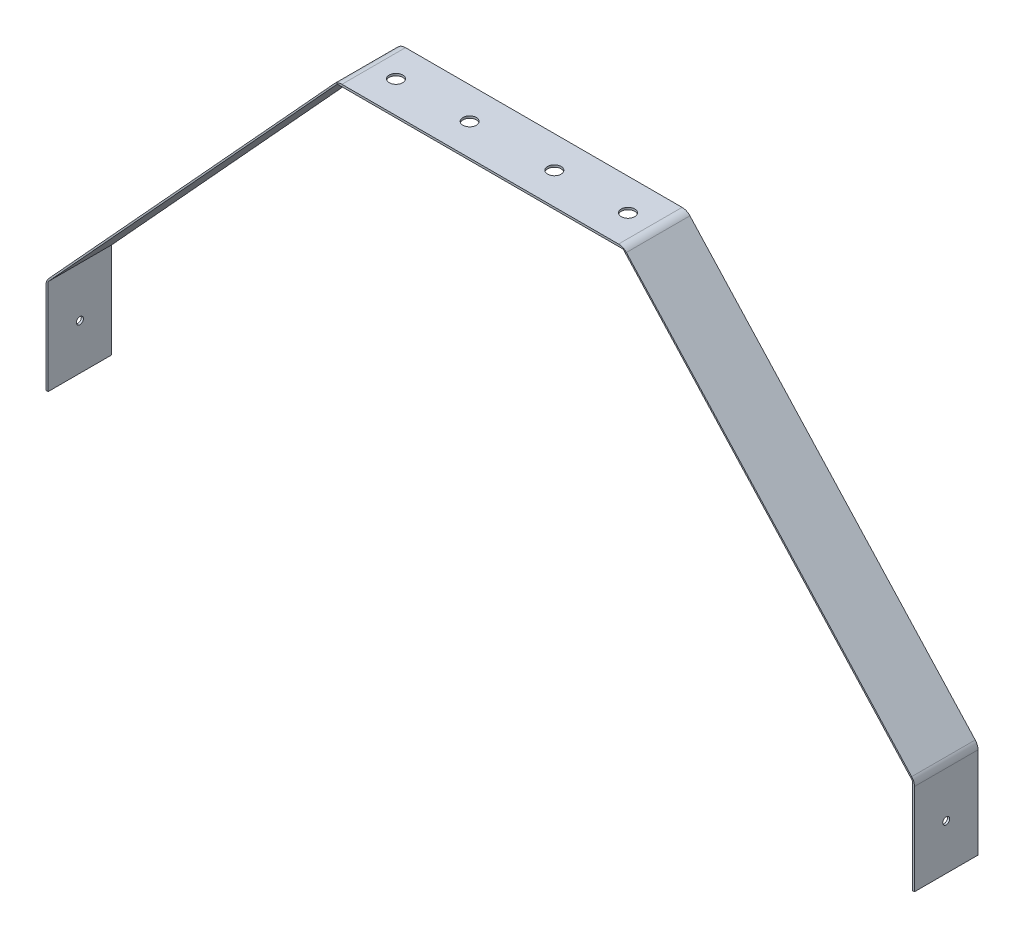
ISO-10303-21;
HEADER;
FILE_DESCRIPTION(('STEP AP214'),'2;1');
FILE_NAME('part.step','',(''),(''),'','','');
FILE_SCHEMA(('AUTOMOTIVE_DESIGN { 1 0 10303 214 1 1 1 1 }'));
ENDSEC;
DATA;
#1=APPLICATION_CONTEXT('core data for automotive mechanical design processes');
#2=APPLICATION_PROTOCOL_DEFINITION('international standard','automotive_design',2000,#1);
#3=PRODUCT_CONTEXT('',#1,'mechanical');
#4=PRODUCT('Part','Part','',(#3));
#5=PRODUCT_RELATED_PRODUCT_CATEGORY('part','',(#4));
#6=PRODUCT_DEFINITION_FORMATION('','',#4);
#7=PRODUCT_DEFINITION_CONTEXT('part definition',#1,'design');
#8=PRODUCT_DEFINITION('design','',#6,#7);
#9=PRODUCT_DEFINITION_SHAPE('','',#8);
#10=(LENGTH_UNIT() NAMED_UNIT(*) SI_UNIT(.MILLI.,.METRE.));
#11=(NAMED_UNIT(*) PLANE_ANGLE_UNIT() SI_UNIT($,.RADIAN.));
#12=(NAMED_UNIT(*) SI_UNIT($,.STERADIAN.) SOLID_ANGLE_UNIT());
#13=UNCERTAINTY_MEASURE_WITH_UNIT(LENGTH_MEASURE(1.E-05),#10,'distance_accuracy_value','');
#14=(GEOMETRIC_REPRESENTATION_CONTEXT(3) GLOBAL_UNCERTAINTY_ASSIGNED_CONTEXT((#13)) GLOBAL_UNIT_ASSIGNED_CONTEXT((#10,
#11,#12)) REPRESENTATION_CONTEXT('',''));
#15=CARTESIAN_POINT('',(0.,0.,0.));
#16=DIRECTION('',(0.,0.,1.));
#17=DIRECTION('',(1.,0.,0.));
#18=AXIS2_PLACEMENT_3D('',#15,#16,#17);
#19=CARTESIAN_POINT('',(-205.,-97.5,30.));
#20=DIRECTION('',(0.,1.,0.));
#21=DIRECTION('',(0.,0.,1.));
#22=AXIS2_PLACEMENT_3D('',#19,#20,#21);
#23=PLANE('',#22);
#24=DIRECTION('',(0.,0.,1.));
#25=VECTOR('',#24,1.);
#26=CARTESIAN_POINT('',(-204.,-97.5,0.));
#27=LINE('',#26,#25);
#28=CARTESIAN_POINT('',(-204.,-97.5,0.));
#29=VERTEX_POINT('',#28);
#30=CARTESIAN_POINT('',(-204.,-97.5,30.));
#31=VERTEX_POINT('',#30);
#32=EDGE_CURVE('E200',#29,#31,#27,.T.);
#33=ORIENTED_EDGE('',*,*,#32,.T.);
#34=DIRECTION('',(1.,0.,0.));
#35=VECTOR('',#34,1.);
#36=CARTESIAN_POINT('',(-205.,-97.5,30.));
#37=LINE('',#36,#35);
#38=CARTESIAN_POINT('',(-205.,-97.5,30.));
#39=VERTEX_POINT('',#38);
#40=EDGE_CURVE('E226',#39,#31,#37,.T.);
#41=ORIENTED_EDGE('',*,*,#40,.F.);
#42=DIRECTION('',(0.,0.,-1.));
#43=VECTOR('',#42,1.);
#44=CARTESIAN_POINT('',(-205.,-97.5,30.));
#45=LINE('',#44,#43);
#46=CARTESIAN_POINT('',(-205.,-97.5,0.));
#47=VERTEX_POINT('',#46);
#48=EDGE_CURVE('E240',#39,#47,#45,.T.);
#49=ORIENTED_EDGE('',*,*,#48,.T.);
#50=DIRECTION('',(1.,0.,0.));
#51=VECTOR('',#50,1.);
#52=CARTESIAN_POINT('',(-205.,-97.5,0.));
#53=LINE('',#52,#51);
#54=EDGE_CURVE('E221',#47,#29,#53,.T.);
#55=ORIENTED_EDGE('',*,*,#54,.T.);
#56=EDGE_LOOP('',(#33,#41,#49,#55));
#57=FACE_BOUND('',#56,.T.);
#58=ADVANCED_FACE('F38',(#57),#23,.F.);
#59=CARTESIAN_POINT('',(205.,97.5,30.));
#60=DIRECTION('',(-1.,0.,0.));
#61=DIRECTION('',(0.,-1.,0.));
#62=AXIS2_PLACEMENT_3D('',#59,#60,#61);
#63=PLANE('',#62);
#64=CARTESIAN_POINT('',(205.,-75.9724592263863,15.));
#65=DIRECTION('',(1.,0.,0.));
#66=DIRECTION('',(0.,1.,0.));
#67=AXIS2_PLACEMENT_3D('',#64,#65,#66);
#68=CIRCLE('',#67,1.65);
#69=CARTESIAN_POINT('',(205.,-74.3224592263863,15.));
#70=VERTEX_POINT('',#69);
#71=EDGE_CURVE('E292',#70,#70,#68,.T.);
#72=ORIENTED_EDGE('',*,*,#71,.F.);
#73=EDGE_LOOP('',(#72));
#74=FACE_BOUND('',#73,.T.);
#75=DIRECTION('',(0.,1.,0.));
#76=VECTOR('',#75,1.);
#77=CARTESIAN_POINT('',(205.,97.5,0.));
#78=LINE('',#77,#76);
#79=CARTESIAN_POINT('',(205.,-97.5,0.));
#80=VERTEX_POINT('',#79);
#81=CARTESIAN_POINT('',(205.,-54.4449184527726,0.));
#82=VERTEX_POINT('',#81);
#83=EDGE_CURVE('E211',#80,#82,#78,.T.);
#84=ORIENTED_EDGE('',*,*,#83,.T.);
#85=DIRECTION('',(0.,0.,1.));
#86=VECTOR('',#85,1.);
#87=CARTESIAN_POINT('',(205.,-54.4449184527726,30.));
#88=LINE('',#87,#86);
#89=CARTESIAN_POINT('',(205.,-54.4449184527726,30.));
#90=VERTEX_POINT('',#89);
#91=EDGE_CURVE('E272',#82,#90,#88,.T.);
#92=ORIENTED_EDGE('',*,*,#91,.T.);
#93=DIRECTION('',(0.,1.,0.));
#94=VECTOR('',#93,1.);
#95=CARTESIAN_POINT('',(205.,97.5,30.));
#96=LINE('',#95,#94);
#97=CARTESIAN_POINT('',(205.,-97.5,30.));
#98=VERTEX_POINT('',#97);
#99=EDGE_CURVE('E218',#98,#90,#96,.T.);
#100=ORIENTED_EDGE('',*,*,#99,.F.);
#101=DIRECTION('',(0.,0.,-1.));
#102=VECTOR('',#101,1.);
#103=CARTESIAN_POINT('',(205.,-97.5,30.));
#104=LINE('',#103,#102);
#105=EDGE_CURVE('E229',#98,#80,#104,.T.);
#106=ORIENTED_EDGE('',*,*,#105,.T.);
#107=EDGE_LOOP('',(#84,#92,#100,#106));
#108=FACE_BOUND('',#107,.T.);
#109=ADVANCED_FACE('F319',(#74,#108),#63,.F.);
#110=CARTESIAN_POINT('',(-205.,97.5,30.));
#111=DIRECTION('',(0.,-1.,0.));
#112=DIRECTION('',(0.,0.,-1.));
#113=AXIS2_PLACEMENT_3D('',#110,#111,#112);
#114=PLANE('',#113);
#115=CARTESIAN_POINT('',(-54.768749878,97.5,15.));
#116=DIRECTION('',(0.,1.,0.));
#117=DIRECTION('',(0.,0.,1.));
#118=AXIS2_PLACEMENT_3D('',#115,#116,#117);
#119=CIRCLE('',#118,3.175);
#120=CARTESIAN_POINT('',(-54.768749878,97.5,18.175));
#121=VERTEX_POINT('',#120);
#122=EDGE_CURVE('E304',#121,#121,#119,.T.);
#123=ORIENTED_EDGE('',*,*,#122,.F.);
#124=EDGE_LOOP('',(#123));
#125=FACE_BOUND('',#124,.T.);
#126=CARTESIAN_POINT('',(54.768750122,97.5,15.));
#127=DIRECTION('',(0.,1.,0.));
#128=DIRECTION('',(0.,0.,1.));
#129=AXIS2_PLACEMENT_3D('',#126,#127,#128);
#130=CIRCLE('',#129,3.17499999999998);
#131=CARTESIAN_POINT('',(54.768750122,97.5,18.175));
#132=VERTEX_POINT('',#131);
#133=EDGE_CURVE('E307',#132,#132,#130,.T.);
#134=ORIENTED_EDGE('',*,*,#133,.F.);
#135=EDGE_LOOP('',(#134));
#136=FACE_BOUND('',#135,.T.);
#137=CARTESIAN_POINT('',(20.,97.5,15.));
#138=DIRECTION('',(0.,1.,0.));
#139=DIRECTION('',(0.,0.,1.));
#140=AXIS2_PLACEMENT_3D('',#137,#138,#139);
#141=CIRCLE('',#140,3.17499999999998);
#142=CARTESIAN_POINT('',(20.,97.5,18.175));
#143=VERTEX_POINT('',#142);
#144=EDGE_CURVE('E303',#143,#143,#141,.T.);
#145=ORIENTED_EDGE('',*,*,#144,.F.);
#146=EDGE_LOOP('',(#145));
#147=FACE_BOUND('',#146,.T.);
#148=CARTESIAN_POINT('',(-20.,97.5,15.));
#149=DIRECTION('',(0.,1.,0.));
#150=DIRECTION('',(0.,0.,1.));
#151=AXIS2_PLACEMENT_3D('',#148,#149,#150);
#152=CIRCLE('',#151,3.175);
#153=CARTESIAN_POINT('',(-20.,97.5,18.175));
#154=VERTEX_POINT('',#153);
#155=EDGE_CURVE('E285',#154,#154,#152,.T.);
#156=ORIENTED_EDGE('',*,*,#155,.F.);
#157=EDGE_LOOP('',(#156));
#158=FACE_BOUND('',#157,.T.);
#159=DIRECTION('',(-1.,0.,0.));
#160=VECTOR('',#159,1.);
#161=CARTESIAN_POINT('',(-205.,97.5,30.));
#162=LINE('',#161,#160);
#163=CARTESIAN_POINT('',(65.3004914182918,97.5,30.));
#164=VERTEX_POINT('',#163);
#165=CARTESIAN_POINT('',(-65.3004914182918,97.5,30.));
#166=VERTEX_POINT('',#165);
#167=EDGE_CURVE('E220',#164,#166,#162,.T.);
#168=ORIENTED_EDGE('',*,*,#167,.F.);
#169=DIRECTION('',(0.,0.,1.));
#170=VECTOR('',#169,1.);
#171=CARTESIAN_POINT('',(65.3004914182918,97.5,0.));
#172=LINE('',#171,#170);
#173=CARTESIAN_POINT('',(65.3004914182918,97.5,0.));
#174=VERTEX_POINT('',#173);
#175=EDGE_CURVE('E267',#164,#174,#172,.F.);
#176=ORIENTED_EDGE('',*,*,#175,.T.);
#177=DIRECTION('',(-1.,0.,0.));
#178=VECTOR('',#177,1.);
#179=CARTESIAN_POINT('',(-205.,97.5,0.));
#180=LINE('',#179,#178);
#181=CARTESIAN_POINT('',(-65.3004914182918,97.5,0.));
#182=VERTEX_POINT('',#181);
#183=EDGE_CURVE('E232',#174,#182,#180,.T.);
#184=ORIENTED_EDGE('',*,*,#183,.T.);
#185=DIRECTION('',(0.,0.,1.));
#186=VECTOR('',#185,1.);
#187=CARTESIAN_POINT('',(-65.3004914182918,97.5,30.));
#188=LINE('',#187,#186);
#189=EDGE_CURVE('E252',#182,#166,#188,.T.);
#190=ORIENTED_EDGE('',*,*,#189,.T.);
#191=EDGE_LOOP('',(#168,#176,#184,#190));
#192=FACE_BOUND('',#191,.T.);
#193=ADVANCED_FACE('F315',(#125,#136,#147,#158,#192),#114,.F.);
#194=CARTESIAN_POINT('',(0.,0.,30.));
#195=DIRECTION('',(0.,0.,1.));
#196=DIRECTION('',(1.,0.,0.));
#197=AXIS2_PLACEMENT_3D('',#194,#195,#196);
#198=PLANE('',#197);
#199=ORIENTED_EDGE('',*,*,#99,.T.);
#200=CARTESIAN_POINT('',(200.,-54.4449184527726,30.));
#201=DIRECTION('',(0.,0.,1.));
#202=DIRECTION('',(1.,0.,0.));
#203=AXIS2_PLACEMENT_3D('',#200,#201,#202);
#204=CIRCLE('',#203,5.);
#205=CARTESIAN_POINT('',(203.685770701004,-51.0662953101859,30.));
#206=VERTEX_POINT('',#205);
#207=EDGE_CURVE('E62',#90,#206,#204,.T.);
#208=ORIENTED_EDGE('',*,*,#207,.T.);
#209=DIRECTION('',(-0.675724628517346,0.737154140200742,0.));
#210=VECTOR('',#209,1.);
#211=CARTESIAN_POINT('',(85.245283018868,78.1415094339622,30.));
#212=LINE('',#211,#210);
#213=CARTESIAN_POINT('',(68.9862621192955,95.8786231425867,30.));
#214=VERTEX_POINT('',#213);
#215=EDGE_CURVE('E199',#206,#214,#212,.T.);
#216=ORIENTED_EDGE('',*,*,#215,.T.);
#217=CARTESIAN_POINT('',(65.3004914182918,92.5,30.));
#218=DIRECTION('',(0.,0.,1.));
#219=DIRECTION('',(1.,0.,0.));
#220=AXIS2_PLACEMENT_3D('',#217,#218,#219);
#221=CIRCLE('',#220,5.);
#222=EDGE_CURVE('E265',#214,#164,#221,.T.);
#223=ORIENTED_EDGE('',*,*,#222,.T.);
#224=ORIENTED_EDGE('',*,*,#167,.T.);
#225=CARTESIAN_POINT('',(-65.3004914182918,92.5,30.));
#226=DIRECTION('',(0.,0.,1.));
#227=DIRECTION('',(1.,0.,0.));
#228=AXIS2_PLACEMENT_3D('',#225,#226,#227);
#229=CIRCLE('',#228,5.);
#230=CARTESIAN_POINT('',(-68.9862621192955,95.8786231425867,30.));
#231=VERTEX_POINT('',#230);
#232=EDGE_CURVE('E255',#166,#231,#229,.T.);
#233=ORIENTED_EDGE('',*,*,#232,.T.);
#234=DIRECTION('',(0.675724628517346,0.737154140200742,0.));
#235=VECTOR('',#234,1.);
#236=CARTESIAN_POINT('',(-85.2452830188679,78.1415094339623,30.));
#237=LINE('',#236,#235);
#238=CARTESIAN_POINT('',(-203.685770701004,-51.0662953101859,30.));
#239=VERTEX_POINT('',#238);
#240=EDGE_CURVE('E212',#239,#231,#237,.T.);
#241=ORIENTED_EDGE('',*,*,#240,.F.);
#242=CARTESIAN_POINT('',(-200.,-54.4449184527726,30.));
#243=DIRECTION('',(0.,0.,1.));
#244=DIRECTION('',(1.,0.,0.));
#245=AXIS2_PLACEMENT_3D('',#242,#243,#244);
#246=CIRCLE('',#245,5.);
#247=CARTESIAN_POINT('',(-205.,-54.4449184527726,30.));
#248=VERTEX_POINT('',#247);
#249=EDGE_CURVE('E246',#239,#248,#246,.T.);
#250=ORIENTED_EDGE('',*,*,#249,.T.);
#251=DIRECTION('',(0.,-1.,0.));
#252=VECTOR('',#251,1.);
#253=CARTESIAN_POINT('',(-205.,97.5,30.));
#254=LINE('',#253,#252);
#255=EDGE_CURVE('E223',#248,#39,#254,.T.);
#256=ORIENTED_EDGE('',*,*,#255,.T.);
#257=ORIENTED_EDGE('',*,*,#40,.T.);
#258=DIRECTION('',(0.,1.,0.));
#259=VECTOR('',#258,1.);
#260=CARTESIAN_POINT('',(-204.,0.,30.));
#261=LINE('',#260,#259);
#262=CARTESIAN_POINT('',(-204.,-52.5,30.));
#263=VERTEX_POINT('',#262);
#264=EDGE_CURVE('E176',#31,#263,#261,.T.);
#265=ORIENTED_EDGE('',*,*,#264,.T.);
#266=DIRECTION('',(0.675500504238443,0.737359524773099,0.));
#267=VECTOR('',#266,1.);
#268=CARTESIAN_POINT('',(-84.7650566633809,77.6538941916208,30.));
#269=LINE('',#268,#267);
#270=CARTESIAN_POINT('',(-67.5,96.5,30.));
#271=VERTEX_POINT('',#270);
#272=EDGE_CURVE('E179',#263,#271,#269,.T.);
#273=ORIENTED_EDGE('',*,*,#272,.T.);
#274=DIRECTION('',(1.,0.,0.));
#275=VECTOR('',#274,1.);
#276=CARTESIAN_POINT('',(0.,96.5,30.));
#277=LINE('',#276,#275);
#278=CARTESIAN_POINT('',(67.5,96.5,30.));
#279=VERTEX_POINT('',#278);
#280=EDGE_CURVE('E192',#271,#279,#277,.T.);
#281=ORIENTED_EDGE('',*,*,#280,.T.);
#282=DIRECTION('',(-0.675500504238443,0.737359524773099,0.));
#283=VECTOR('',#282,1.);
#284=CARTESIAN_POINT('',(84.7650566633809,77.6538941916208,30.));
#285=LINE('',#284,#283);
#286=CARTESIAN_POINT('',(204.,-52.5,30.));
#287=VERTEX_POINT('',#286);
#288=EDGE_CURVE('E190',#287,#279,#285,.T.);
#289=ORIENTED_EDGE('',*,*,#288,.F.);
#290=DIRECTION('',(0.,1.,0.));
#291=VECTOR('',#290,1.);
#292=CARTESIAN_POINT('',(204.,0.,30.));
#293=LINE('',#292,#291);
#294=CARTESIAN_POINT('',(204.,-97.5,30.));
#295=VERTEX_POINT('',#294);
#296=EDGE_CURVE('E157',#295,#287,#293,.T.);
#297=ORIENTED_EDGE('',*,*,#296,.F.);
#298=EDGE_CURVE('E225',#295,#98,#37,.T.);
#299=ORIENTED_EDGE('',*,*,#298,.T.);
#300=EDGE_LOOP('',(#199,#208,#216,#223,#224,#233,#241,#250,#256,#257,#265,#273,#281,#289,#297,#299));
#301=FACE_BOUND('',#300,.T.);
#302=ADVANCED_FACE('F318',(#301),#198,.T.);
#303=CARTESIAN_POINT('',(0.,0.,0.));
#304=DIRECTION('',(0.,0.,1.));
#305=DIRECTION('',(1.,0.,0.));
#306=AXIS2_PLACEMENT_3D('',#303,#304,#305);
#307=PLANE('',#306);
#308=DIRECTION('',(-0.675724628517346,0.737154140200742,0.));
#309=VECTOR('',#308,1.);
#310=CARTESIAN_POINT('',(85.245283018868,78.1415094339622,0.));
#311=LINE('',#310,#309);
#312=CARTESIAN_POINT('',(203.685770701004,-51.0662953101859,0.));
#313=VERTEX_POINT('',#312);
#314=CARTESIAN_POINT('',(68.9862621192955,95.8786231425867,0.));
#315=VERTEX_POINT('',#314);
#316=EDGE_CURVE('E215',#313,#315,#311,.T.);
#317=ORIENTED_EDGE('',*,*,#316,.F.);
#318=CARTESIAN_POINT('',(200.,-54.4449184527726,0.));
#319=DIRECTION('',(0.,0.,1.));
#320=DIRECTION('',(1.,0.,0.));
#321=AXIS2_PLACEMENT_3D('',#318,#319,#320);
#322=CIRCLE('',#321,5.);
#323=EDGE_CURVE('E11',#313,#82,#322,.F.);
#324=ORIENTED_EDGE('',*,*,#323,.T.);
#325=ORIENTED_EDGE('',*,*,#83,.F.);
#326=CARTESIAN_POINT('',(204.,-97.5,0.));
#327=VERTEX_POINT('',#326);
#328=EDGE_CURVE('E175',#327,#80,#53,.T.);
#329=ORIENTED_EDGE('',*,*,#328,.F.);
#330=DIRECTION('',(0.,1.,0.));
#331=VECTOR('',#330,1.);
#332=CARTESIAN_POINT('',(204.,0.,0.));
#333=LINE('',#332,#331);
#334=CARTESIAN_POINT('',(204.,-52.5,0.));
#335=VERTEX_POINT('',#334);
#336=EDGE_CURVE('E154',#327,#335,#333,.T.);
#337=ORIENTED_EDGE('',*,*,#336,.T.);
#338=DIRECTION('',(-0.675500504238443,0.737359524773099,0.));
#339=VECTOR('',#338,1.);
#340=CARTESIAN_POINT('',(84.7650566633809,77.6538941916208,0.));
#341=LINE('',#340,#339);
#342=CARTESIAN_POINT('',(67.5,96.5,0.));
#343=VERTEX_POINT('',#342);
#344=EDGE_CURVE('E166',#335,#343,#341,.T.);
#345=ORIENTED_EDGE('',*,*,#344,.T.);
#346=DIRECTION('',(1.,0.,0.));
#347=VECTOR('',#346,1.);
#348=CARTESIAN_POINT('',(0.,96.5,0.));
#349=LINE('',#348,#347);
#350=CARTESIAN_POINT('',(-67.5,96.5,0.));
#351=VERTEX_POINT('',#350);
#352=EDGE_CURVE('E170',#351,#343,#349,.T.);
#353=ORIENTED_EDGE('',*,*,#352,.F.);
#354=DIRECTION('',(0.675500504238443,0.737359524773099,0.));
#355=VECTOR('',#354,1.);
#356=CARTESIAN_POINT('',(-84.7650566633809,77.6538941916208,0.));
#357=LINE('',#356,#355);
#358=CARTESIAN_POINT('',(-204.,-52.5,0.));
#359=VERTEX_POINT('',#358);
#360=EDGE_CURVE('E186',#359,#351,#357,.T.);
#361=ORIENTED_EDGE('',*,*,#360,.F.);
#362=DIRECTION('',(0.,1.,0.));
#363=VECTOR('',#362,1.);
#364=CARTESIAN_POINT('',(-204.,0.,0.));
#365=LINE('',#364,#363);
#366=EDGE_CURVE('E162',#29,#359,#365,.T.);
#367=ORIENTED_EDGE('',*,*,#366,.F.);
#368=ORIENTED_EDGE('',*,*,#54,.F.);
#369=DIRECTION('',(0.,-1.,0.));
#370=VECTOR('',#369,1.);
#371=CARTESIAN_POINT('',(-205.,97.5,0.));
#372=LINE('',#371,#370);
#373=CARTESIAN_POINT('',(-205.,-54.4449184527726,0.));
#374=VERTEX_POINT('',#373);
#375=EDGE_CURVE('E234',#374,#47,#372,.T.);
#376=ORIENTED_EDGE('',*,*,#375,.F.);
#377=CARTESIAN_POINT('',(-200.,-54.4449184527726,0.));
#378=DIRECTION('',(0.,0.,1.));
#379=DIRECTION('',(1.,0.,0.));
#380=AXIS2_PLACEMENT_3D('',#377,#378,#379);
#381=CIRCLE('',#380,5.);
#382=CARTESIAN_POINT('',(-203.685770701004,-51.0662953101859,0.));
#383=VERTEX_POINT('',#382);
#384=EDGE_CURVE('E250',#374,#383,#381,.F.);
#385=ORIENTED_EDGE('',*,*,#384,.T.);
#386=DIRECTION('',(0.675724628517346,0.737154140200742,0.));
#387=VECTOR('',#386,1.);
#388=CARTESIAN_POINT('',(-85.2452830188679,78.1415094339623,0.));
#389=LINE('',#388,#387);
#390=CARTESIAN_POINT('',(-68.9862621192955,95.8786231425867,0.));
#391=VERTEX_POINT('',#390);
#392=EDGE_CURVE('E208',#383,#391,#389,.T.);
#393=ORIENTED_EDGE('',*,*,#392,.T.);
#394=CARTESIAN_POINT('',(-65.3004914182918,92.5,0.));
#395=DIRECTION('',(0.,0.,1.));
#396=DIRECTION('',(1.,0.,0.));
#397=AXIS2_PLACEMENT_3D('',#394,#395,#396);
#398=CIRCLE('',#397,5.);
#399=EDGE_CURVE('E259',#391,#182,#398,.F.);
#400=ORIENTED_EDGE('',*,*,#399,.T.);
#401=ORIENTED_EDGE('',*,*,#183,.F.);
#402=CARTESIAN_POINT('',(65.3004914182918,92.5,0.));
#403=DIRECTION('',(0.,0.,1.));
#404=DIRECTION('',(1.,0.,0.));
#405=AXIS2_PLACEMENT_3D('',#402,#403,#404);
#406=CIRCLE('',#405,5.);
#407=EDGE_CURVE('E269',#174,#315,#406,.F.);
#408=ORIENTED_EDGE('',*,*,#407,.T.);
#409=EDGE_LOOP('',(#317,#324,#325,#329,#337,#345,#353,#361,#367,#368,#376,#385,#393,#400,#401,#408));
#410=FACE_BOUND('',#409,.T.);
#411=ADVANCED_FACE('F173',(#410),#307,.F.);
#412=CARTESIAN_POINT('',(-205.,97.5,30.));
#413=DIRECTION('',(1.,0.,0.));
#414=DIRECTION('',(0.,1.,0.));
#415=AXIS2_PLACEMENT_3D('',#412,#413,#414);
#416=PLANE('',#415);
#417=CARTESIAN_POINT('',(-205.,-75.9724592263863,15.));
#418=DIRECTION('',(1.,0.,0.));
#419=DIRECTION('',(0.,1.,0.));
#420=AXIS2_PLACEMENT_3D('',#417,#418,#419);
#421=CIRCLE('',#420,1.65);
#422=CARTESIAN_POINT('',(-205.,-74.3224592263863,15.));
#423=VERTEX_POINT('',#422);
#424=EDGE_CURVE('E280',#423,#423,#421,.T.);
#425=ORIENTED_EDGE('',*,*,#424,.T.);
#426=EDGE_LOOP('',(#425));
#427=FACE_BOUND('',#426,.T.);
#428=ORIENTED_EDGE('',*,*,#255,.F.);
#429=DIRECTION('',(0.,0.,1.));
#430=VECTOR('',#429,1.);
#431=CARTESIAN_POINT('',(-205.,-54.4449184527726,30.));
#432=LINE('',#431,#430);
#433=EDGE_CURVE('E248',#248,#374,#432,.F.);
#434=ORIENTED_EDGE('',*,*,#433,.T.);
#435=ORIENTED_EDGE('',*,*,#375,.T.);
#436=ORIENTED_EDGE('',*,*,#48,.F.);
#437=EDGE_LOOP('',(#428,#434,#435,#436));
#438=FACE_BOUND('',#437,.T.);
#439=ADVANCED_FACE('F351',(#427,#438),#416,.F.);
#440=ORIENTED_EDGE('',*,*,#298,.F.);
#441=DIRECTION('',(0.,0.,1.));
#442=VECTOR('',#441,1.);
#443=CARTESIAN_POINT('',(204.,-97.5,0.));
#444=LINE('',#443,#442);
#445=EDGE_CURVE('E197',#327,#295,#444,.T.);
#446=ORIENTED_EDGE('',*,*,#445,.F.);
#447=ORIENTED_EDGE('',*,*,#328,.T.);
#448=ORIENTED_EDGE('',*,*,#105,.F.);
#449=EDGE_LOOP('',(#440,#446,#447,#448));
#450=FACE_BOUND('',#449,.T.);
#451=ADVANCED_FACE('F371',(#450),#23,.F.);
#452=CARTESIAN_POINT('',(85.245283018868,78.1415094339622,0.));
#453=DIRECTION('',(0.737154140200742,0.675724628517346,0.));
#454=DIRECTION('',(-0.675724628517346,0.737154140200742,0.));
#455=AXIS2_PLACEMENT_3D('',#452,#453,#454);
#456=PLANE('',#455);
#457=ORIENTED_EDGE('',*,*,#215,.F.);
#458=DIRECTION('',(0.,0.,1.));
#459=VECTOR('',#458,1.);
#460=CARTESIAN_POINT('',(203.685770701004,-51.0662953101859,0.));
#461=LINE('',#460,#459);
#462=EDGE_CURVE('E47',#206,#313,#461,.F.);
#463=ORIENTED_EDGE('',*,*,#462,.T.);
#464=ORIENTED_EDGE('',*,*,#316,.T.);
#465=DIRECTION('',(0.,0.,1.));
#466=VECTOR('',#465,1.);
#467=CARTESIAN_POINT('',(68.9862621192955,95.8786231425867,30.));
#468=LINE('',#467,#466);
#469=EDGE_CURVE('E262',#315,#214,#468,.T.);
#470=ORIENTED_EDGE('',*,*,#469,.T.);
#471=EDGE_LOOP('',(#457,#463,#464,#470));
#472=FACE_BOUND('',#471,.T.);
#473=ADVANCED_FACE('F395',(#472),#456,.T.);
#474=CARTESIAN_POINT('',(-85.2452830188679,78.1415094339623,0.));
#475=DIRECTION('',(0.737154140200741,-0.675724628517346,0.));
#476=DIRECTION('',(0.675724628517346,0.737154140200742,0.));
#477=AXIS2_PLACEMENT_3D('',#474,#475,#476);
#478=PLANE('',#477);
#479=ORIENTED_EDGE('',*,*,#240,.T.);
#480=DIRECTION('',(0.,0.,1.));
#481=VECTOR('',#480,1.);
#482=CARTESIAN_POINT('',(-68.9862621192955,95.8786231425867,0.));
#483=LINE('',#482,#481);
#484=EDGE_CURVE('E257',#231,#391,#483,.F.);
#485=ORIENTED_EDGE('',*,*,#484,.T.);
#486=ORIENTED_EDGE('',*,*,#392,.F.);
#487=DIRECTION('',(0.,0.,1.));
#488=VECTOR('',#487,1.);
#489=CARTESIAN_POINT('',(-203.685770701004,-51.0662953101859,0.));
#490=LINE('',#489,#488);
#491=EDGE_CURVE('E243',#383,#239,#490,.T.);
#492=ORIENTED_EDGE('',*,*,#491,.T.);
#493=EDGE_LOOP('',(#479,#485,#486,#492));
#494=FACE_BOUND('',#493,.T.);
#495=ADVANCED_FACE('F342',(#494),#478,.F.);
#496=CARTESIAN_POINT('',(204.,0.,0.));
#497=DIRECTION('',(1.,0.,0.));
#498=DIRECTION('',(0.,0.,-1.));
#499=AXIS2_PLACEMENT_3D('',#496,#497,#498);
#500=PLANE('',#499);
#501=CARTESIAN_POINT('',(204.,-75.9724592263863,15.));
#502=DIRECTION('',(1.,0.,0.));
#503=DIRECTION('',(0.,0.,-1.));
#504=AXIS2_PLACEMENT_3D('',#501,#502,#503);
#505=CIRCLE('',#504,1.65);
#506=CARTESIAN_POINT('',(204.,-75.9724592263863,13.35));
#507=VERTEX_POINT('',#506);
#508=EDGE_CURVE('E182',#507,#507,#505,.T.);
#509=ORIENTED_EDGE('',*,*,#508,.T.);
#510=EDGE_LOOP('',(#509));
#511=FACE_BOUND('',#510,.T.);
#512=ORIENTED_EDGE('',*,*,#296,.T.);
#513=DIRECTION('',(0.,0.,1.));
#514=VECTOR('',#513,1.);
#515=CARTESIAN_POINT('',(204.,-52.5,0.));
#516=LINE('',#515,#514);
#517=EDGE_CURVE('E150',#335,#287,#516,.T.);
#518=ORIENTED_EDGE('',*,*,#517,.F.);
#519=ORIENTED_EDGE('',*,*,#336,.F.);
#520=ORIENTED_EDGE('',*,*,#445,.T.);
#521=EDGE_LOOP('',(#512,#518,#519,#520));
#522=FACE_BOUND('',#521,.T.);
#523=ADVANCED_FACE('F152',(#511,#522),#500,.F.);
#524=CARTESIAN_POINT('',(-204.,0.,0.));
#525=DIRECTION('',(1.,0.,0.));
#526=DIRECTION('',(0.,0.,-1.));
#527=AXIS2_PLACEMENT_3D('',#524,#525,#526);
#528=PLANE('',#527);
#529=CARTESIAN_POINT('',(-204.,-75.9724592263863,15.));
#530=DIRECTION('',(1.,0.,0.));
#531=DIRECTION('',(0.,0.,-1.));
#532=AXIS2_PLACEMENT_3D('',#529,#530,#531);
#533=CIRCLE('',#532,1.65);
#534=CARTESIAN_POINT('',(-204.,-75.9724592263863,13.35));
#535=VERTEX_POINT('',#534);
#536=EDGE_CURVE('E277',#535,#535,#533,.T.);
#537=ORIENTED_EDGE('',*,*,#536,.F.);
#538=EDGE_LOOP('',(#537));
#539=FACE_BOUND('',#538,.T.);
#540=ORIENTED_EDGE('',*,*,#264,.F.);
#541=ORIENTED_EDGE('',*,*,#32,.F.);
#542=ORIENTED_EDGE('',*,*,#366,.T.);
#543=DIRECTION('',(0.,0.,1.));
#544=VECTOR('',#543,1.);
#545=CARTESIAN_POINT('',(-204.,-52.5,0.));
#546=LINE('',#545,#544);
#547=EDGE_CURVE('E203',#359,#263,#546,.T.);
#548=ORIENTED_EDGE('',*,*,#547,.T.);
#549=EDGE_LOOP('',(#540,#541,#542,#548));
#550=FACE_BOUND('',#549,.T.);
#551=ADVANCED_FACE('F358',(#539,#550),#528,.T.);
#552=CARTESIAN_POINT('',(-84.7650566633809,77.6538941916208,0.));
#553=DIRECTION('',(0.737359524773099,-0.675500504238443,0.));
#554=DIRECTION('',(0.675500504238443,0.737359524773099,0.));
#555=AXIS2_PLACEMENT_3D('',#552,#553,#554);
#556=PLANE('',#555);
#557=ORIENTED_EDGE('',*,*,#272,.F.);
#558=ORIENTED_EDGE('',*,*,#547,.F.);
#559=ORIENTED_EDGE('',*,*,#360,.T.);
#560=DIRECTION('',(0.,0.,1.));
#561=VECTOR('',#560,1.);
#562=CARTESIAN_POINT('',(-67.5,96.5,0.));
#563=LINE('',#562,#561);
#564=EDGE_CURVE('E205',#351,#271,#563,.T.);
#565=ORIENTED_EDGE('',*,*,#564,.T.);
#566=EDGE_LOOP('',(#557,#558,#559,#565));
#567=FACE_BOUND('',#566,.T.);
#568=ADVANCED_FACE('F363',(#567),#556,.T.);
#569=CARTESIAN_POINT('',(0.,96.5,0.));
#570=DIRECTION('',(0.,-1.,0.));
#571=DIRECTION('',(0.,0.,-1.));
#572=AXIS2_PLACEMENT_3D('',#569,#570,#571);
#573=PLANE('',#572);
#574=CARTESIAN_POINT('',(-54.768749878,96.5,15.));
#575=DIRECTION('',(0.,-1.,0.));
#576=DIRECTION('',(0.,0.,-1.));
#577=AXIS2_PLACEMENT_3D('',#574,#575,#576);
#578=CIRCLE('',#577,3.175);
#579=CARTESIAN_POINT('',(-54.768749878,96.5,11.825));
#580=VERTEX_POINT('',#579);
#581=EDGE_CURVE('E42',#580,#580,#578,.T.);
#582=ORIENTED_EDGE('',*,*,#581,.F.);
#583=EDGE_LOOP('',(#582));
#584=FACE_BOUND('',#583,.T.);
#585=CARTESIAN_POINT('',(54.768750122,96.5,15.));
#586=DIRECTION('',(0.,-1.,0.));
#587=DIRECTION('',(0.,0.,-1.));
#588=AXIS2_PLACEMENT_3D('',#585,#586,#587);
#589=CIRCLE('',#588,3.17499999999998);
#590=CARTESIAN_POINT('',(54.768750122,96.5,11.825));
#591=VERTEX_POINT('',#590);
#592=EDGE_CURVE('E287',#591,#591,#589,.T.);
#593=ORIENTED_EDGE('',*,*,#592,.F.);
#594=EDGE_LOOP('',(#593));
#595=FACE_BOUND('',#594,.T.);
#596=CARTESIAN_POINT('',(20.,96.5,15.));
#597=DIRECTION('',(0.,-1.,0.));
#598=DIRECTION('',(0.,0.,-1.));
#599=AXIS2_PLACEMENT_3D('',#596,#597,#598);
#600=CIRCLE('',#599,3.17499999999998);
#601=CARTESIAN_POINT('',(20.,96.5,11.825));
#602=VERTEX_POINT('',#601);
#603=EDGE_CURVE('E284',#602,#602,#600,.T.);
#604=ORIENTED_EDGE('',*,*,#603,.F.);
#605=EDGE_LOOP('',(#604));
#606=FACE_BOUND('',#605,.T.);
#607=CARTESIAN_POINT('',(-20.,96.5,15.));
#608=DIRECTION('',(0.,-1.,0.));
#609=DIRECTION('',(0.,0.,-1.));
#610=AXIS2_PLACEMENT_3D('',#607,#608,#609);
#611=CIRCLE('',#610,3.175);
#612=CARTESIAN_POINT('',(-20.,96.5,11.825));
#613=VERTEX_POINT('',#612);
#614=EDGE_CURVE('E281',#613,#613,#611,.T.);
#615=ORIENTED_EDGE('',*,*,#614,.F.);
#616=EDGE_LOOP('',(#615));
#617=FACE_BOUND('',#616,.T.);
#618=ORIENTED_EDGE('',*,*,#280,.F.);
#619=ORIENTED_EDGE('',*,*,#564,.F.);
#620=ORIENTED_EDGE('',*,*,#352,.T.);
#621=DIRECTION('',(0.,0.,1.));
#622=VECTOR('',#621,1.);
#623=CARTESIAN_POINT('',(67.5,96.5,0.));
#624=LINE('',#623,#622);
#625=EDGE_CURVE('E161',#343,#279,#624,.T.);
#626=ORIENTED_EDGE('',*,*,#625,.T.);
#627=EDGE_LOOP('',(#618,#619,#620,#626));
#628=FACE_BOUND('',#627,.T.);
#629=ADVANCED_FACE('F367',(#584,#595,#606,#617,#628),#573,.T.);
#630=CARTESIAN_POINT('',(84.7650566633809,77.6538941916208,0.));
#631=DIRECTION('',(0.737359524773099,0.675500504238442,0.));
#632=DIRECTION('',(-0.675500504238443,0.737359524773099,0.));
#633=AXIS2_PLACEMENT_3D('',#630,#631,#632);
#634=PLANE('',#633);
#635=ORIENTED_EDGE('',*,*,#288,.T.);
#636=ORIENTED_EDGE('',*,*,#625,.F.);
#637=ORIENTED_EDGE('',*,*,#344,.F.);
#638=ORIENTED_EDGE('',*,*,#517,.T.);
#639=EDGE_LOOP('',(#635,#636,#637,#638));
#640=FACE_BOUND('',#639,.T.);
#641=ADVANCED_FACE('F167',(#640),#634,.F.);
#642=CARTESIAN_POINT('',(-200.,-54.4449184527726,0.));
#643=DIRECTION('',(0.,0.,1.));
#644=DIRECTION('',(1.,0.,0.));
#645=AXIS2_PLACEMENT_3D('',#642,#643,#644);
#646=CYLINDRICAL_SURFACE('',#645,5.);
#647=ORIENTED_EDGE('',*,*,#384,.F.);
#648=ORIENTED_EDGE('',*,*,#433,.F.);
#649=ORIENTED_EDGE('',*,*,#249,.F.);
#650=ORIENTED_EDGE('',*,*,#491,.F.);
#651=EDGE_LOOP('',(#647,#648,#649,#650));
#652=FACE_BOUND('',#651,.T.);
#653=ADVANCED_FACE('F346',(#652),#646,.T.);
#654=CARTESIAN_POINT('',(-65.3004914182918,92.5,30.));
#655=DIRECTION('',(0.,0.,1.));
#656=DIRECTION('',(1.,0.,0.));
#657=AXIS2_PLACEMENT_3D('',#654,#655,#656);
#658=CYLINDRICAL_SURFACE('',#657,5.);
#659=ORIENTED_EDGE('',*,*,#399,.F.);
#660=ORIENTED_EDGE('',*,*,#484,.F.);
#661=ORIENTED_EDGE('',*,*,#232,.F.);
#662=ORIENTED_EDGE('',*,*,#189,.F.);
#663=EDGE_LOOP('',(#659,#660,#661,#662));
#664=FACE_BOUND('',#663,.T.);
#665=ADVANCED_FACE('F339',(#664),#658,.T.);
#666=CARTESIAN_POINT('',(65.3004914182918,92.5,0.));
#667=DIRECTION('',(0.,0.,-1.));
#668=DIRECTION('',(-1.,0.,0.));
#669=AXIS2_PLACEMENT_3D('',#666,#667,#668);
#670=CYLINDRICAL_SURFACE('',#669,5.);
#671=ORIENTED_EDGE('',*,*,#407,.F.);
#672=ORIENTED_EDGE('',*,*,#175,.F.);
#673=ORIENTED_EDGE('',*,*,#222,.F.);
#674=ORIENTED_EDGE('',*,*,#469,.F.);
#675=EDGE_LOOP('',(#671,#672,#673,#674));
#676=FACE_BOUND('',#675,.T.);
#677=ADVANCED_FACE('F332',(#676),#670,.T.);
#678=CARTESIAN_POINT('',(200.,-54.4449184527726,30.));
#679=DIRECTION('',(0.,0.,-1.));
#680=DIRECTION('',(-1.,0.,0.));
#681=AXIS2_PLACEMENT_3D('',#678,#679,#680);
#682=CYLINDRICAL_SURFACE('',#681,5.);
#683=ORIENTED_EDGE('',*,*,#323,.F.);
#684=ORIENTED_EDGE('',*,*,#462,.F.);
#685=ORIENTED_EDGE('',*,*,#207,.F.);
#686=ORIENTED_EDGE('',*,*,#91,.F.);
#687=EDGE_LOOP('',(#683,#684,#685,#686));
#688=FACE_BOUND('',#687,.T.);
#689=ADVANCED_FACE('F40',(#688),#682,.T.);
#690=CARTESIAN_POINT('',(-205.,-75.9724592263863,15.));
#691=DIRECTION('',(1.,0.,0.));
#692=DIRECTION('',(0.,1.,0.));
#693=AXIS2_PLACEMENT_3D('',#690,#691,#692);
#694=CYLINDRICAL_SURFACE('',#693,1.65);
#695=ORIENTED_EDGE('',*,*,#536,.T.);
#696=EDGE_LOOP('',(#695));
#697=FACE_BOUND('',#696,.T.);
#698=ORIENTED_EDGE('',*,*,#424,.F.);
#699=EDGE_LOOP('',(#698));
#700=FACE_BOUND('',#699,.T.);
#701=ADVANCED_FACE('F377',(#697,#700),#694,.F.);
#702=ORIENTED_EDGE('',*,*,#71,.T.);
#703=EDGE_LOOP('',(#702));
#704=FACE_BOUND('',#703,.T.);
#705=ORIENTED_EDGE('',*,*,#508,.F.);
#706=EDGE_LOOP('',(#705));
#707=FACE_BOUND('',#706,.T.);
#708=ADVANCED_FACE('F382',(#704,#707),#694,.F.);
#709=CARTESIAN_POINT('',(-20.,87.5,15.));
#710=DIRECTION('',(0.,1.,0.));
#711=DIRECTION('',(0.,0.,1.));
#712=AXIS2_PLACEMENT_3D('',#709,#710,#711);
#713=CYLINDRICAL_SURFACE('',#712,3.175);
#714=ORIENTED_EDGE('',*,*,#614,.T.);
#715=EDGE_LOOP('',(#714));
#716=FACE_BOUND('',#715,.T.);
#717=ORIENTED_EDGE('',*,*,#155,.T.);
#718=EDGE_LOOP('',(#717));
#719=FACE_BOUND('',#718,.T.);
#720=ADVANCED_FACE('F494',(#716,#719),#713,.F.);
#721=CARTESIAN_POINT('',(20.,87.5,15.));
#722=DIRECTION('',(0.,1.,0.));
#723=DIRECTION('',(0.,0.,1.));
#724=AXIS2_PLACEMENT_3D('',#721,#722,#723);
#725=CYLINDRICAL_SURFACE('',#724,3.17499999999998);
#726=ORIENTED_EDGE('',*,*,#603,.T.);
#727=EDGE_LOOP('',(#726));
#728=FACE_BOUND('',#727,.T.);
#729=ORIENTED_EDGE('',*,*,#144,.T.);
#730=EDGE_LOOP('',(#729));
#731=FACE_BOUND('',#730,.T.);
#732=ADVANCED_FACE('F313',(#728,#731),#725,.F.);
#733=CARTESIAN_POINT('',(54.768750122,87.5,15.));
#734=DIRECTION('',(0.,1.,0.));
#735=DIRECTION('',(0.,0.,1.));
#736=AXIS2_PLACEMENT_3D('',#733,#734,#735);
#737=CYLINDRICAL_SURFACE('',#736,3.17499999999998);
#738=ORIENTED_EDGE('',*,*,#592,.T.);
#739=EDGE_LOOP('',(#738));
#740=FACE_BOUND('',#739,.T.);
#741=ORIENTED_EDGE('',*,*,#133,.T.);
#742=EDGE_LOOP('',(#741));
#743=FACE_BOUND('',#742,.T.);
#744=ADVANCED_FACE('F526',(#740,#743),#737,.F.);
#745=CARTESIAN_POINT('',(-54.768749878,87.5,15.));
#746=DIRECTION('',(0.,1.,0.));
#747=DIRECTION('',(0.,0.,1.));
#748=AXIS2_PLACEMENT_3D('',#745,#746,#747);
#749=CYLINDRICAL_SURFACE('',#748,3.175);
#750=ORIENTED_EDGE('',*,*,#581,.T.);
#751=EDGE_LOOP('',(#750));
#752=FACE_BOUND('',#751,.T.);
#753=ORIENTED_EDGE('',*,*,#122,.T.);
#754=EDGE_LOOP('',(#753));
#755=FACE_BOUND('',#754,.T.);
#756=ADVANCED_FACE('F536',(#752,#755),#749,.F.);
#757=CLOSED_SHELL('',(#58,#109,#193,#302,#411,#439,#451,#473,#495,#523,#551,#568,#629,#641,#653,
#665,#677,#689,#701,#708,#720,#732,#744,#756));
#758=MANIFOLD_SOLID_BREP('B2',#757);
#759=ADVANCED_BREP_SHAPE_REPRESENTATION('',(#18,#758),#14);
#760=SHAPE_DEFINITION_REPRESENTATION(#9,#759);
ENDSEC;
END-ISO-10303-21;
